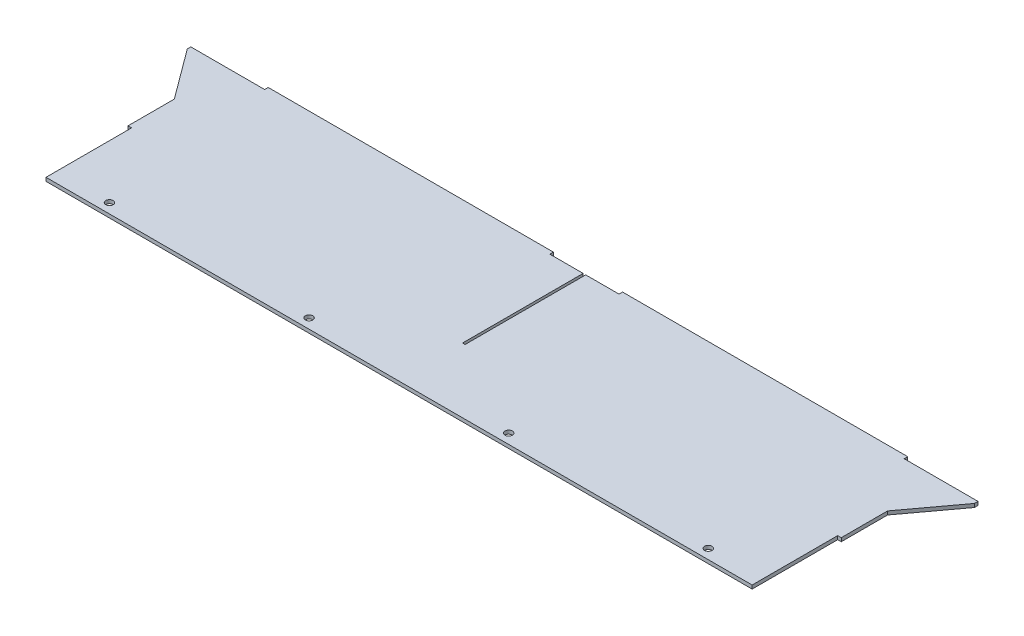
ISO-10303-21;
HEADER;
FILE_DESCRIPTION(('STEP AP214'),'2;1');
FILE_NAME('part.step','',(''),(''),'','','');
FILE_SCHEMA(('AUTOMOTIVE_DESIGN { 1 0 10303 214 1 1 1 1 }'));
ENDSEC;
DATA;
#1=APPLICATION_CONTEXT('core data for automotive mechanical design processes');
#2=APPLICATION_PROTOCOL_DEFINITION('international standard','automotive_design',2000,#1);
#3=PRODUCT_CONTEXT('',#1,'mechanical');
#4=PRODUCT('Part','Part','',(#3));
#5=PRODUCT_RELATED_PRODUCT_CATEGORY('part','',(#4));
#6=PRODUCT_DEFINITION_FORMATION('','',#4);
#7=PRODUCT_DEFINITION_CONTEXT('part definition',#1,'design');
#8=PRODUCT_DEFINITION('design','',#6,#7);
#9=PRODUCT_DEFINITION_SHAPE('','',#8);
#10=(LENGTH_UNIT() NAMED_UNIT(*) SI_UNIT(.MILLI.,.METRE.));
#11=(NAMED_UNIT(*) PLANE_ANGLE_UNIT() SI_UNIT($,.RADIAN.));
#12=(NAMED_UNIT(*) SI_UNIT($,.STERADIAN.) SOLID_ANGLE_UNIT());
#13=UNCERTAINTY_MEASURE_WITH_UNIT(LENGTH_MEASURE(1.E-05),#10,'distance_accuracy_value','');
#14=(GEOMETRIC_REPRESENTATION_CONTEXT(3) GLOBAL_UNCERTAINTY_ASSIGNED_CONTEXT((#13)) GLOBAL_UNIT_ASSIGNED_CONTEXT((#10,
#11,#12)) REPRESENTATION_CONTEXT('',''));
#15=CARTESIAN_POINT('',(0.,0.,0.));
#16=DIRECTION('',(0.,0.,1.));
#17=DIRECTION('',(1.,0.,0.));
#18=AXIS2_PLACEMENT_3D('',#15,#16,#17);
#19=CARTESIAN_POINT('',(-266.7,1.5875,73.8124000000001));
#20=DIRECTION('',(0.,1.,0.));
#21=DIRECTION('',(0.,0.,1.));
#22=AXIS2_PLACEMENT_3D('',#19,#20,#21);
#23=CYLINDRICAL_SURFACE('',#22,3.3);
#24=CARTESIAN_POINT('',(-266.7,-1.58750000000007,73.8124000000001));
#25=DIRECTION('',(0.,1.,0.));
#26=DIRECTION('',(0.,0.,1.));
#27=AXIS2_PLACEMENT_3D('',#24,#25,#26);
#28=CIRCLE('',#27,3.30000000000003);
#29=CARTESIAN_POINT('',(-266.7,-1.58750000000007,77.1124000000001));
#30=VERTEX_POINT('',#29);
#31=EDGE_CURVE('E46',#30,#30,#28,.T.);
#32=ORIENTED_EDGE('',*,*,#31,.F.);
#33=EDGE_LOOP('',(#32));
#34=FACE_BOUND('',#33,.T.);
#35=CARTESIAN_POINT('',(-266.7,1.5875,73.8124000000001));
#36=DIRECTION('',(0.,1.,0.));
#37=DIRECTION('',(0.,0.,1.));
#38=AXIS2_PLACEMENT_3D('',#35,#36,#37);
#39=CIRCLE('',#38,3.29999999999997);
#40=CARTESIAN_POINT('',(-266.7,1.5875,77.1124000000001));
#41=VERTEX_POINT('',#40);
#42=EDGE_CURVE('E11',#41,#41,#39,.T.);
#43=ORIENTED_EDGE('',*,*,#42,.T.);
#44=EDGE_LOOP('',(#43));
#45=FACE_BOUND('',#44,.T.);
#46=ADVANCED_FACE('F39',(#34,#45),#23,.F.);
#47=CARTESIAN_POINT('',(-88.8999999999999,1.5875,73.8124000000001));
#48=DIRECTION('',(0.,1.,0.));
#49=DIRECTION('',(0.,0.,1.));
#50=AXIS2_PLACEMENT_3D('',#47,#48,#49);
#51=CYLINDRICAL_SURFACE('',#50,3.3);
#52=CARTESIAN_POINT('',(-88.8999999999999,-1.58750000000007,73.8124000000001));
#53=DIRECTION('',(0.,1.,0.));
#54=DIRECTION('',(0.,0.,1.));
#55=AXIS2_PLACEMENT_3D('',#52,#53,#54);
#56=CIRCLE('',#55,3.30000000000003);
#57=CARTESIAN_POINT('',(-88.8999999999999,-1.58750000000007,77.1124000000001));
#58=VERTEX_POINT('',#57);
#59=EDGE_CURVE('E226',#58,#58,#56,.T.);
#60=ORIENTED_EDGE('',*,*,#59,.F.);
#61=EDGE_LOOP('',(#60));
#62=FACE_BOUND('',#61,.T.);
#63=CARTESIAN_POINT('',(-88.8999999999999,1.5875,73.8124000000001));
#64=DIRECTION('',(0.,1.,0.));
#65=DIRECTION('',(0.,0.,1.));
#66=AXIS2_PLACEMENT_3D('',#63,#64,#65);
#67=CIRCLE('',#66,3.29999999999997);
#68=CARTESIAN_POINT('',(-88.8999999999999,1.5875,77.1124000000001));
#69=VERTEX_POINT('',#68);
#70=EDGE_CURVE('E230',#69,#69,#67,.T.);
#71=ORIENTED_EDGE('',*,*,#70,.T.);
#72=EDGE_LOOP('',(#71));
#73=FACE_BOUND('',#72,.T.);
#74=ADVANCED_FACE('F258',(#62,#73),#51,.F.);
#75=CARTESIAN_POINT('',(317.6778,1.5875,-82.55));
#76=DIRECTION('',(-1.,0.,0.));
#77=DIRECTION('',(0.,0.,1.));
#78=AXIS2_PLACEMENT_3D('',#75,#76,#77);
#79=PLANE('',#78);
#80=DIRECTION('',(0.,-1.,0.));
#81=VECTOR('',#80,1.);
#82=CARTESIAN_POINT('',(317.6778,1.5875,6.35000000000007));
#83=LINE('',#82,#81);
#84=CARTESIAN_POINT('',(317.6778,1.5875,6.35000000000007));
#85=VERTEX_POINT('',#84);
#86=CARTESIAN_POINT('',(317.6778,-1.5875,6.35000000000007));
#87=VERTEX_POINT('',#86);
#88=EDGE_CURVE('E709',#85,#87,#83,.T.);
#89=ORIENTED_EDGE('',*,*,#88,.T.);
#90=DIRECTION('',(0.,0.,-1.));
#91=VECTOR('',#90,1.);
#92=CARTESIAN_POINT('',(317.6778,-1.5875,-82.55));
#93=LINE('',#92,#91);
#94=CARTESIAN_POINT('',(317.6778,-1.5875,-34.925));
#95=VERTEX_POINT('',#94);
#96=EDGE_CURVE('E236',#87,#95,#93,.T.);
#97=ORIENTED_EDGE('',*,*,#96,.T.);
#98=DIRECTION('',(0.,-1.,0.));
#99=VECTOR('',#98,1.);
#100=CARTESIAN_POINT('',(317.6778,1.5875,-34.925));
#101=LINE('',#100,#99);
#102=CARTESIAN_POINT('',(317.6778,1.5875,-34.925));
#103=VERTEX_POINT('',#102);
#104=EDGE_CURVE('E674',#103,#95,#101,.T.);
#105=ORIENTED_EDGE('',*,*,#104,.F.);
#106=DIRECTION('',(0.,0.,-1.));
#107=VECTOR('',#106,1.);
#108=CARTESIAN_POINT('',(317.6778,1.5875,-82.55));
#109=LINE('',#108,#107);
#110=EDGE_CURVE('E248',#85,#103,#109,.T.);
#111=ORIENTED_EDGE('',*,*,#110,.F.);
#112=EDGE_LOOP('',(#89,#97,#105,#111));
#113=FACE_BOUND('',#112,.T.);
#114=ADVANCED_FACE('F288',(#113),#79,.F.);
#115=CARTESIAN_POINT('',(-317.6778,1.5875,-82.55));
#116=DIRECTION('',(0.,0.,1.));
#117=DIRECTION('',(1.,0.,0.));
#118=AXIS2_PLACEMENT_3D('',#115,#116,#117);
#119=PLANE('',#118);
#120=DIRECTION('',(0.,-1.,0.));
#121=VECTOR('',#120,1.);
#122=CARTESIAN_POINT('',(-1.14299999999998,1.5875,-82.55));
#123=LINE('',#122,#121);
#124=CARTESIAN_POINT('',(-1.14299999999998,1.5875,-82.55));
#125=VERTEX_POINT('',#124);
#126=CARTESIAN_POINT('',(-1.14299999999998,-1.5875,-82.55));
#127=VERTEX_POINT('',#126);
#128=EDGE_CURVE('E642',#125,#127,#123,.T.);
#129=ORIENTED_EDGE('',*,*,#128,.T.);
#130=DIRECTION('',(-1.,0.,0.));
#131=VECTOR('',#130,1.);
#132=CARTESIAN_POINT('',(-317.6778,-1.5875,-82.55));
#133=LINE('',#132,#131);
#134=CARTESIAN_POINT('',(-30.8229000000015,-1.5875,-82.55));
#135=VERTEX_POINT('',#134);
#136=EDGE_CURVE('E244',#127,#135,#133,.T.);
#137=ORIENTED_EDGE('',*,*,#136,.T.);
#138=DIRECTION('',(0.,-1.,0.));
#139=VECTOR('',#138,1.);
#140=CARTESIAN_POINT('',(-30.8229000000015,-1.58750000000007,-82.55));
#141=LINE('',#140,#139);
#142=CARTESIAN_POINT('',(-30.8229000000015,1.5875,-82.55));
#143=VERTEX_POINT('',#142);
#144=EDGE_CURVE('E568',#143,#135,#141,.T.);
#145=ORIENTED_EDGE('',*,*,#144,.F.);
#146=DIRECTION('',(-1.,0.,0.));
#147=VECTOR('',#146,1.);
#148=CARTESIAN_POINT('',(-317.6778,1.5875,-82.55));
#149=LINE('',#148,#147);
#150=EDGE_CURVE('E584',#125,#143,#149,.T.);
#151=ORIENTED_EDGE('',*,*,#150,.F.);
#152=EDGE_LOOP('',(#129,#137,#145,#151));
#153=FACE_BOUND('',#152,.T.);
#154=ADVANCED_FACE('F271',(#153),#119,.F.);
#155=CARTESIAN_POINT('',(-317.6778,1.5875,82.55));
#156=DIRECTION('',(0.,0.,-1.));
#157=DIRECTION('',(-1.,0.,0.));
#158=AXIS2_PLACEMENT_3D('',#155,#156,#157);
#159=PLANE('',#158);
#160=DIRECTION('',(1.,0.,0.));
#161=VECTOR('',#160,1.);
#162=CARTESIAN_POINT('',(-317.6778,-1.5875,82.55));
#163=LINE('',#162,#161);
#164=CARTESIAN_POINT('',(-314.5028,-1.5875,82.55));
#165=VERTEX_POINT('',#164);
#166=CARTESIAN_POINT('',(314.5028,-1.5875,82.55));
#167=VERTEX_POINT('',#166);
#168=EDGE_CURVE('E247',#165,#167,#163,.T.);
#169=ORIENTED_EDGE('',*,*,#168,.T.);
#170=DIRECTION('',(0.,-1.,0.));
#171=VECTOR('',#170,1.);
#172=CARTESIAN_POINT('',(314.5028,1.5875,82.55));
#173=LINE('',#172,#171);
#174=CARTESIAN_POINT('',(314.5028,1.5875,82.55));
#175=VERTEX_POINT('',#174);
#176=EDGE_CURVE('E225',#175,#167,#173,.T.);
#177=ORIENTED_EDGE('',*,*,#176,.F.);
#178=DIRECTION('',(1.,0.,0.));
#179=VECTOR('',#178,1.);
#180=CARTESIAN_POINT('',(-317.6778,1.5875,82.55));
#181=LINE('',#180,#179);
#182=CARTESIAN_POINT('',(-314.5028,1.5875,82.55));
#183=VERTEX_POINT('',#182);
#184=EDGE_CURVE('E219',#183,#175,#181,.T.);
#185=ORIENTED_EDGE('',*,*,#184,.F.);
#186=DIRECTION('',(0.,-1.,0.));
#187=VECTOR('',#186,1.);
#188=CARTESIAN_POINT('',(-314.5028,1.5875,82.55));
#189=LINE('',#188,#187);
#190=EDGE_CURVE('E200',#183,#165,#189,.T.);
#191=ORIENTED_EDGE('',*,*,#190,.T.);
#192=EDGE_LOOP('',(#169,#177,#185,#191));
#193=FACE_BOUND('',#192,.T.);
#194=ADVANCED_FACE('F224',(#193),#159,.F.);
#195=CARTESIAN_POINT('',(0.,1.5875,0.));
#196=DIRECTION('',(0.,1.,0.));
#197=DIRECTION('',(0.,0.,1.));
#198=AXIS2_PLACEMENT_3D('',#195,#196,#197);
#199=PLANE('',#198);
#200=CARTESIAN_POINT('',(88.9000000000001,1.5875,73.8124000000001));
#201=DIRECTION('',(0.,1.,0.));
#202=DIRECTION('',(0.,0.,1.));
#203=AXIS2_PLACEMENT_3D('',#200,#201,#202);
#204=CIRCLE('',#203,3.29999999999997);
#205=CARTESIAN_POINT('',(88.9000000000001,1.5875,77.1124000000001));
#206=VERTEX_POINT('',#205);
#207=EDGE_CURVE('E742',#206,#206,#204,.T.);
#208=ORIENTED_EDGE('',*,*,#207,.F.);
#209=EDGE_LOOP('',(#208));
#210=FACE_BOUND('',#209,.T.);
#211=CARTESIAN_POINT('',(266.7,1.5875,73.8124000000001));
#212=DIRECTION('',(0.,1.,0.));
#213=DIRECTION('',(0.,0.,1.));
#214=AXIS2_PLACEMENT_3D('',#211,#212,#213);
#215=CIRCLE('',#214,3.29999999999997);
#216=CARTESIAN_POINT('',(266.7,1.5875,77.1124000000001));
#217=VERTEX_POINT('',#216);
#218=EDGE_CURVE('E739',#217,#217,#215,.T.);
#219=ORIENTED_EDGE('',*,*,#218,.F.);
#220=EDGE_LOOP('',(#219));
#221=FACE_BOUND('',#220,.T.);
#222=DIRECTION('',(0.,0.,-1.));
#223=VECTOR('',#222,1.);
#224=CARTESIAN_POINT('',(314.5028,1.5875,0.));
#225=LINE('',#224,#223);
#226=CARTESIAN_POINT('',(314.5028,1.5875,6.35000000000006));
#227=VERTEX_POINT('',#226);
#228=EDGE_CURVE('E714',#175,#227,#225,.T.);
#229=ORIENTED_EDGE('',*,*,#228,.T.);
#230=DIRECTION('',(-1.,0.,0.));
#231=VECTOR('',#230,1.);
#232=CARTESIAN_POINT('',(0.,1.5875,6.34999999999998));
#233=LINE('',#232,#231);
#234=EDGE_CURVE('E716',#85,#227,#233,.T.);
#235=ORIENTED_EDGE('',*,*,#234,.F.);
#236=ORIENTED_EDGE('',*,*,#110,.T.);
#237=DIRECTION('',(-0.594932036507486,0.,0.803776008560255));
#238=VECTOR('',#237,1.);
#239=CARTESIAN_POINT('',(350.57842,1.5875,-79.375));
#240=LINE('',#239,#238);
#241=CARTESIAN_POINT('',(350.57842,1.5875,-79.375));
#242=VERTEX_POINT('',#241);
#243=EDGE_CURVE('E665',#242,#103,#240,.T.);
#244=ORIENTED_EDGE('',*,*,#243,.F.);
#245=DIRECTION('',(0.,0.,1.));
#246=VECTOR('',#245,1.);
#247=CARTESIAN_POINT('',(350.57842,1.5875,-82.55));
#248=LINE('',#247,#246);
#249=CARTESIAN_POINT('',(350.57842,1.5875,-82.55));
#250=VERTEX_POINT('',#249);
#251=EDGE_CURVE('E662',#250,#242,#248,.T.);
#252=ORIENTED_EDGE('',*,*,#251,.F.);
#253=CARTESIAN_POINT('',(284.822900000001,1.5875,-82.55));
#254=VERTEX_POINT('',#253);
#255=EDGE_CURVE('E232',#250,#254,#149,.T.);
#256=ORIENTED_EDGE('',*,*,#255,.T.);
#257=DIRECTION('',(0.,0.,1.));
#258=VECTOR('',#257,1.);
#259=CARTESIAN_POINT('',(284.822900000001,1.58749999999994,-85.725));
#260=LINE('',#259,#258);
#261=CARTESIAN_POINT('',(284.822900000001,1.58749999999994,-85.725));
#262=VERTEX_POINT('',#261);
#263=EDGE_CURVE('E691',#262,#254,#260,.T.);
#264=ORIENTED_EDGE('',*,*,#263,.F.);
#265=DIRECTION('',(1.,0.,0.));
#266=VECTOR('',#265,1.);
#267=CARTESIAN_POINT('',(284.822900000001,1.58749999999994,-85.725));
#268=LINE('',#267,#266);
#269=CARTESIAN_POINT('',(30.8229000000015,1.58749999999994,-85.725));
#270=VERTEX_POINT('',#269);
#271=EDGE_CURVE('E689',#270,#262,#268,.T.);
#272=ORIENTED_EDGE('',*,*,#271,.F.);
#273=DIRECTION('',(0.,0.,1.));
#274=VECTOR('',#273,1.);
#275=CARTESIAN_POINT('',(30.8229000000015,1.58749999999994,-85.725));
#276=LINE('',#275,#274);
#277=CARTESIAN_POINT('',(30.8229000000014,1.5875,-82.55));
#278=VERTEX_POINT('',#277);
#279=EDGE_CURVE('E696',#270,#278,#276,.T.);
#280=ORIENTED_EDGE('',*,*,#279,.T.);
#281=CARTESIAN_POINT('',(1.14300000000002,1.5875,-82.55));
#282=VERTEX_POINT('',#281);
#283=EDGE_CURVE('E583',#278,#282,#149,.T.);
#284=ORIENTED_EDGE('',*,*,#283,.T.);
#285=DIRECTION('',(0.,0.,1.));
#286=VECTOR('',#285,1.);
#287=CARTESIAN_POINT('',(1.14300000000002,1.5875,0.));
#288=LINE('',#287,#286);
#289=CARTESIAN_POINT('',(1.14300000000002,1.5875,24.892));
#290=VERTEX_POINT('',#289);
#291=EDGE_CURVE('E646',#282,#290,#288,.T.);
#292=ORIENTED_EDGE('',*,*,#291,.T.);
#293=DIRECTION('',(1.,0.,0.));
#294=VECTOR('',#293,1.);
#295=CARTESIAN_POINT('',(0.,1.5875,24.892));
#296=LINE('',#295,#294);
#297=CARTESIAN_POINT('',(-1.14299999999998,1.5875,24.892));
#298=VERTEX_POINT('',#297);
#299=EDGE_CURVE('E631',#298,#290,#296,.T.);
#300=ORIENTED_EDGE('',*,*,#299,.F.);
#301=DIRECTION('',(0.,0.,1.));
#302=VECTOR('',#301,1.);
#303=CARTESIAN_POINT('',(-1.14299999999998,1.5875,0.));
#304=LINE('',#303,#302);
#305=EDGE_CURVE('E594',#125,#298,#304,.T.);
#306=ORIENTED_EDGE('',*,*,#305,.F.);
#307=ORIENTED_EDGE('',*,*,#150,.T.);
#308=DIRECTION('',(0.,0.,1.));
#309=VECTOR('',#308,1.);
#310=CARTESIAN_POINT('',(-30.8229000000015,1.58749999999994,-85.725));
#311=LINE('',#310,#309);
#312=CARTESIAN_POINT('',(-30.8229000000015,1.58749999999994,-85.725));
#313=VERTEX_POINT('',#312);
#314=EDGE_CURVE('E574',#313,#143,#311,.T.);
#315=ORIENTED_EDGE('',*,*,#314,.F.);
#316=DIRECTION('',(1.,0.,0.));
#317=VECTOR('',#316,1.);
#318=CARTESIAN_POINT('',(-30.8229000000015,1.58749999999994,-85.725));
#319=LINE('',#318,#317);
#320=CARTESIAN_POINT('',(-284.822900000001,1.58749999999994,-85.725));
#321=VERTEX_POINT('',#320);
#322=EDGE_CURVE('E573',#321,#313,#319,.T.);
#323=ORIENTED_EDGE('',*,*,#322,.F.);
#324=DIRECTION('',(0.,0.,1.));
#325=VECTOR('',#324,1.);
#326=CARTESIAN_POINT('',(-284.822900000001,1.58749999999994,-85.725));
#327=LINE('',#326,#325);
#328=CARTESIAN_POINT('',(-284.822900000001,1.58749999999994,-82.55));
#329=VERTEX_POINT('',#328);
#330=EDGE_CURVE('E562',#321,#329,#327,.T.);
#331=ORIENTED_EDGE('',*,*,#330,.T.);
#332=CARTESIAN_POINT('',(-350.57842,1.5875,-82.55));
#333=VERTEX_POINT('',#332);
#334=EDGE_CURVE('E570',#329,#333,#149,.T.);
#335=ORIENTED_EDGE('',*,*,#334,.T.);
#336=DIRECTION('',(0.,0.,1.));
#337=VECTOR('',#336,1.);
#338=CARTESIAN_POINT('',(-350.57842,1.5875,-82.55));
#339=LINE('',#338,#337);
#340=CARTESIAN_POINT('',(-350.57842,1.5875,-79.375));
#341=VERTEX_POINT('',#340);
#342=EDGE_CURVE('E649',#333,#341,#339,.T.);
#343=ORIENTED_EDGE('',*,*,#342,.T.);
#344=DIRECTION('',(0.594932036507486,0.,0.803776008560255));
#345=VECTOR('',#344,1.);
#346=CARTESIAN_POINT('',(-350.57842,1.5875,-79.375));
#347=LINE('',#346,#345);
#348=CARTESIAN_POINT('',(-317.6778,1.5875,-34.925));
#349=VERTEX_POINT('',#348);
#350=EDGE_CURVE('E647',#341,#349,#347,.T.);
#351=ORIENTED_EDGE('',*,*,#350,.T.);
#352=DIRECTION('',(0.,0.,1.));
#353=VECTOR('',#352,1.);
#354=CARTESIAN_POINT('',(-317.6778,1.5875,-82.55));
#355=LINE('',#354,#353);
#356=CARTESIAN_POINT('',(-317.6778,1.5875,6.34999999999999));
#357=VERTEX_POINT('',#356);
#358=EDGE_CURVE('E227',#349,#357,#355,.T.);
#359=ORIENTED_EDGE('',*,*,#358,.T.);
#360=DIRECTION('',(1.,0.,0.));
#361=VECTOR('',#360,1.);
#362=CARTESIAN_POINT('',(0.,1.5875,6.34999999999999));
#363=LINE('',#362,#361);
#364=CARTESIAN_POINT('',(-314.5028,1.5875,6.34999999999999));
#365=VERTEX_POINT('',#364);
#366=EDGE_CURVE('E211',#357,#365,#363,.T.);
#367=ORIENTED_EDGE('',*,*,#366,.T.);
#368=DIRECTION('',(0.,0.,-1.));
#369=VECTOR('',#368,1.);
#370=CARTESIAN_POINT('',(-314.5028,1.5875,0.));
#371=LINE('',#370,#369);
#372=EDGE_CURVE('E203',#183,#365,#371,.T.);
#373=ORIENTED_EDGE('',*,*,#372,.F.);
#374=ORIENTED_EDGE('',*,*,#184,.T.);
#375=EDGE_LOOP('',(#229,#235,#236,#244,#252,#256,#264,#272,#280,#284,#292,#300,#306,#307,#315,
#323,#331,#335,#343,#351,#359,#367,#373,#374));
#376=FACE_BOUND('',#375,.T.);
#377=ORIENTED_EDGE('',*,*,#70,.F.);
#378=EDGE_LOOP('',(#377));
#379=FACE_BOUND('',#378,.T.);
#380=ORIENTED_EDGE('',*,*,#42,.F.);
#381=EDGE_LOOP('',(#380));
#382=FACE_BOUND('',#381,.T.);
#383=ADVANCED_FACE('F217',(#210,#221,#376,#379,#382),#199,.T.);
#384=CARTESIAN_POINT('',(0.,-1.5875,0.));
#385=DIRECTION('',(0.,1.,0.));
#386=DIRECTION('',(0.,0.,1.));
#387=AXIS2_PLACEMENT_3D('',#384,#385,#386);
#388=PLANE('',#387);
#389=CARTESIAN_POINT('',(88.9000000000001,-1.58750000000007,73.8124000000001));
#390=DIRECTION('',(0.,1.,0.));
#391=DIRECTION('',(0.,0.,1.));
#392=AXIS2_PLACEMENT_3D('',#389,#390,#391);
#393=CIRCLE('',#392,3.30000000000003);
#394=CARTESIAN_POINT('',(88.9000000000001,-1.58750000000007,77.1124000000001));
#395=VERTEX_POINT('',#394);
#396=EDGE_CURVE('E745',#395,#395,#393,.T.);
#397=ORIENTED_EDGE('',*,*,#396,.T.);
#398=EDGE_LOOP('',(#397));
#399=FACE_BOUND('',#398,.T.);
#400=CARTESIAN_POINT('',(266.7,-1.58750000000007,73.8124000000001));
#401=DIRECTION('',(0.,1.,0.));
#402=DIRECTION('',(0.,0.,1.));
#403=AXIS2_PLACEMENT_3D('',#400,#401,#402);
#404=CIRCLE('',#403,3.30000000000003);
#405=CARTESIAN_POINT('',(266.7,-1.58750000000007,77.1124000000001));
#406=VERTEX_POINT('',#405);
#407=EDGE_CURVE('E718',#406,#406,#404,.T.);
#408=ORIENTED_EDGE('',*,*,#407,.T.);
#409=EDGE_LOOP('',(#408));
#410=FACE_BOUND('',#409,.T.);
#411=DIRECTION('',(-1.,0.,0.));
#412=VECTOR('',#411,1.);
#413=CARTESIAN_POINT('',(0.,-1.5875,6.34999999999998));
#414=LINE('',#413,#412);
#415=CARTESIAN_POINT('',(314.5028,-1.5875,6.35000000000006));
#416=VERTEX_POINT('',#415);
#417=EDGE_CURVE('E711',#87,#416,#414,.T.);
#418=ORIENTED_EDGE('',*,*,#417,.T.);
#419=DIRECTION('',(0.,0.,-1.));
#420=VECTOR('',#419,1.);
#421=CARTESIAN_POINT('',(314.5028,-1.5875,0.));
#422=LINE('',#421,#420);
#423=EDGE_CURVE('E713',#167,#416,#422,.T.);
#424=ORIENTED_EDGE('',*,*,#423,.F.);
#425=ORIENTED_EDGE('',*,*,#168,.F.);
#426=DIRECTION('',(0.,0.,-1.));
#427=VECTOR('',#426,1.);
#428=CARTESIAN_POINT('',(-314.5028,-1.5875,0.));
#429=LINE('',#428,#427);
#430=CARTESIAN_POINT('',(-314.5028,-1.5875,6.34999999999999));
#431=VERTEX_POINT('',#430);
#432=EDGE_CURVE('E206',#165,#431,#429,.T.);
#433=ORIENTED_EDGE('',*,*,#432,.T.);
#434=DIRECTION('',(1.,0.,0.));
#435=VECTOR('',#434,1.);
#436=CARTESIAN_POINT('',(0.,-1.5875,6.34999999999999));
#437=LINE('',#436,#435);
#438=CARTESIAN_POINT('',(-317.6778,-1.5875,6.34999999999998));
#439=VERTEX_POINT('',#438);
#440=EDGE_CURVE('E221',#439,#431,#437,.T.);
#441=ORIENTED_EDGE('',*,*,#440,.F.);
#442=DIRECTION('',(0.,0.,1.));
#443=VECTOR('',#442,1.);
#444=CARTESIAN_POINT('',(-317.6778,-1.5875,-82.55));
#445=LINE('',#444,#443);
#446=CARTESIAN_POINT('',(-317.6778,-1.5875,-34.925));
#447=VERTEX_POINT('',#446);
#448=EDGE_CURVE('E242',#447,#439,#445,.T.);
#449=ORIENTED_EDGE('',*,*,#448,.F.);
#450=DIRECTION('',(0.594932036507486,0.,0.803776008560255));
#451=VECTOR('',#450,1.);
#452=CARTESIAN_POINT('',(-350.57842,-1.5875,-79.375));
#453=LINE('',#452,#451);
#454=CARTESIAN_POINT('',(-350.57842,-1.5875,-79.375));
#455=VERTEX_POINT('',#454);
#456=EDGE_CURVE('E640',#455,#447,#453,.T.);
#457=ORIENTED_EDGE('',*,*,#456,.F.);
#458=DIRECTION('',(0.,0.,1.));
#459=VECTOR('',#458,1.);
#460=CARTESIAN_POINT('',(-350.57842,-1.5875,-82.55));
#461=LINE('',#460,#459);
#462=CARTESIAN_POINT('',(-350.57842,-1.5875,-82.55));
#463=VERTEX_POINT('',#462);
#464=EDGE_CURVE('E614',#463,#455,#461,.T.);
#465=ORIENTED_EDGE('',*,*,#464,.F.);
#466=CARTESIAN_POINT('',(-284.822900000001,-1.5875,-82.55));
#467=VERTEX_POINT('',#466);
#468=EDGE_CURVE('E238',#467,#463,#133,.T.);
#469=ORIENTED_EDGE('',*,*,#468,.F.);
#470=DIRECTION('',(0.,0.,1.));
#471=VECTOR('',#470,1.);
#472=CARTESIAN_POINT('',(-284.822900000001,-1.58750000000007,-85.725));
#473=LINE('',#472,#471);
#474=CARTESIAN_POINT('',(-284.822900000001,-1.58750000000007,-85.725));
#475=VERTEX_POINT('',#474);
#476=EDGE_CURVE('E565',#475,#467,#473,.T.);
#477=ORIENTED_EDGE('',*,*,#476,.F.);
#478=DIRECTION('',(-1.,0.,0.));
#479=VECTOR('',#478,1.);
#480=CARTESIAN_POINT('',(-30.8229000000015,-1.58750000000007,-85.725));
#481=LINE('',#480,#479);
#482=CARTESIAN_POINT('',(-30.8229000000015,-1.58750000000007,-85.725));
#483=VERTEX_POINT('',#482);
#484=EDGE_CURVE('E602',#483,#475,#481,.T.);
#485=ORIENTED_EDGE('',*,*,#484,.F.);
#486=DIRECTION('',(0.,0.,1.));
#487=VECTOR('',#486,1.);
#488=CARTESIAN_POINT('',(-30.8229000000015,-1.58750000000007,-85.725));
#489=LINE('',#488,#487);
#490=EDGE_CURVE('E239',#483,#135,#489,.T.);
#491=ORIENTED_EDGE('',*,*,#490,.T.);
#492=ORIENTED_EDGE('',*,*,#136,.F.);
#493=DIRECTION('',(0.,0.,1.));
#494=VECTOR('',#493,1.);
#495=CARTESIAN_POINT('',(-1.14299999999998,-1.5875,0.));
#496=LINE('',#495,#494);
#497=CARTESIAN_POINT('',(-1.14299999999998,-1.5875,24.892));
#498=VERTEX_POINT('',#497);
#499=EDGE_CURVE('E632',#127,#498,#496,.T.);
#500=ORIENTED_EDGE('',*,*,#499,.T.);
#501=DIRECTION('',(1.,0.,0.));
#502=VECTOR('',#501,1.);
#503=CARTESIAN_POINT('',(0.,-1.5875,24.892));
#504=LINE('',#503,#502);
#505=CARTESIAN_POINT('',(1.14300000000002,-1.5875,24.892));
#506=VERTEX_POINT('',#505);
#507=EDGE_CURVE('E53',#498,#506,#504,.T.);
#508=ORIENTED_EDGE('',*,*,#507,.T.);
#509=DIRECTION('',(0.,0.,1.));
#510=VECTOR('',#509,1.);
#511=CARTESIAN_POINT('',(1.14300000000002,-1.5875,0.));
#512=LINE('',#511,#510);
#513=CARTESIAN_POINT('',(1.14300000000002,-1.5875,-82.55));
#514=VERTEX_POINT('',#513);
#515=EDGE_CURVE('E628',#514,#506,#512,.T.);
#516=ORIENTED_EDGE('',*,*,#515,.F.);
#517=CARTESIAN_POINT('',(30.8229000000015,-1.58750000000007,-82.55));
#518=VERTEX_POINT('',#517);
#519=EDGE_CURVE('E243',#518,#514,#133,.T.);
#520=ORIENTED_EDGE('',*,*,#519,.F.);
#521=DIRECTION('',(0.,0.,1.));
#522=VECTOR('',#521,1.);
#523=CARTESIAN_POINT('',(30.8229000000015,-1.58750000000007,-85.725));
#524=LINE('',#523,#522);
#525=CARTESIAN_POINT('',(30.8229000000015,-1.58750000000007,-85.725));
#526=VERTEX_POINT('',#525);
#527=EDGE_CURVE('E625',#526,#518,#524,.T.);
#528=ORIENTED_EDGE('',*,*,#527,.F.);
#529=DIRECTION('',(-1.,0.,0.));
#530=VECTOR('',#529,1.);
#531=CARTESIAN_POINT('',(284.822900000001,-1.58750000000007,-85.725));
#532=LINE('',#531,#530);
#533=CARTESIAN_POINT('',(284.822900000001,-1.58750000000007,-85.725));
#534=VERTEX_POINT('',#533);
#535=EDGE_CURVE('E685',#534,#526,#532,.T.);
#536=ORIENTED_EDGE('',*,*,#535,.F.);
#537=DIRECTION('',(0.,0.,1.));
#538=VECTOR('',#537,1.);
#539=CARTESIAN_POINT('',(284.822900000001,-1.58750000000007,-85.725));
#540=LINE('',#539,#538);
#541=CARTESIAN_POINT('',(284.822900000001,-1.5875,-82.55));
#542=VERTEX_POINT('',#541);
#543=EDGE_CURVE('E599',#534,#542,#540,.T.);
#544=ORIENTED_EDGE('',*,*,#543,.T.);
#545=CARTESIAN_POINT('',(350.57842,-1.5875,-82.55));
#546=VERTEX_POINT('',#545);
#547=EDGE_CURVE('E240',#546,#542,#133,.T.);
#548=ORIENTED_EDGE('',*,*,#547,.F.);
#549=DIRECTION('',(0.,0.,1.));
#550=VECTOR('',#549,1.);
#551=CARTESIAN_POINT('',(350.57842,-1.5875,-82.55));
#552=LINE('',#551,#550);
#553=CARTESIAN_POINT('',(350.57842,-1.5875,-79.375));
#554=VERTEX_POINT('',#553);
#555=EDGE_CURVE('E656',#546,#554,#552,.T.);
#556=ORIENTED_EDGE('',*,*,#555,.T.);
#557=DIRECTION('',(-0.594932036507486,0.,0.803776008560255));
#558=VECTOR('',#557,1.);
#559=CARTESIAN_POINT('',(350.57842,-1.5875,-79.375));
#560=LINE('',#559,#558);
#561=EDGE_CURVE('E666',#554,#95,#560,.T.);
#562=ORIENTED_EDGE('',*,*,#561,.T.);
#563=ORIENTED_EDGE('',*,*,#96,.F.);
#564=EDGE_LOOP('',(#418,#424,#425,#433,#441,#449,#457,#465,#469,#477,#485,#491,#492,#500,#508,
#516,#520,#528,#536,#544,#548,#556,#562,#563));
#565=FACE_BOUND('',#564,.T.);
#566=ORIENTED_EDGE('',*,*,#59,.T.);
#567=EDGE_LOOP('',(#566));
#568=FACE_BOUND('',#567,.T.);
#569=ORIENTED_EDGE('',*,*,#31,.T.);
#570=EDGE_LOOP('',(#569));
#571=FACE_BOUND('',#570,.T.);
#572=ADVANCED_FACE('F254',(#399,#410,#565,#568,#571),#388,.F.);
#573=DIRECTION('',(0.,-1.,0.));
#574=VECTOR('',#573,1.);
#575=CARTESIAN_POINT('',(284.822900000001,-1.58750000000007,-82.55));
#576=LINE('',#575,#574);
#577=EDGE_CURVE('E677',#254,#542,#576,.T.);
#578=ORIENTED_EDGE('',*,*,#577,.F.);
#579=ORIENTED_EDGE('',*,*,#255,.F.);
#580=DIRECTION('',(0.,-1.,0.));
#581=VECTOR('',#580,1.);
#582=CARTESIAN_POINT('',(350.57842,1.5875,-82.55));
#583=LINE('',#582,#581);
#584=EDGE_CURVE('E669',#250,#546,#583,.T.);
#585=ORIENTED_EDGE('',*,*,#584,.T.);
#586=ORIENTED_EDGE('',*,*,#547,.T.);
#587=EDGE_LOOP('',(#578,#579,#585,#586));
#588=FACE_BOUND('',#587,.T.);
#589=ADVANCED_FACE('F268',(#588),#119,.F.);
#590=ORIENTED_EDGE('',*,*,#519,.T.);
#591=DIRECTION('',(0.,-1.,0.));
#592=VECTOR('',#591,1.);
#593=CARTESIAN_POINT('',(1.14300000000002,1.5875,-82.55));
#594=LINE('',#593,#592);
#595=EDGE_CURVE('E619',#282,#514,#594,.T.);
#596=ORIENTED_EDGE('',*,*,#595,.F.);
#597=ORIENTED_EDGE('',*,*,#283,.F.);
#598=DIRECTION('',(0.,1.,0.));
#599=VECTOR('',#598,1.);
#600=CARTESIAN_POINT('',(30.8229000000015,1.58749999999994,-82.55));
#601=LINE('',#600,#599);
#602=EDGE_CURVE('E621',#518,#278,#601,.T.);
#603=ORIENTED_EDGE('',*,*,#602,.F.);
#604=EDGE_LOOP('',(#590,#596,#597,#603));
#605=FACE_BOUND('',#604,.T.);
#606=ADVANCED_FACE('F286',(#605),#119,.F.);
#607=DIRECTION('',(0.,1.,0.));
#608=VECTOR('',#607,1.);
#609=CARTESIAN_POINT('',(-284.822900000001,1.58749999999994,-82.55));
#610=LINE('',#609,#608);
#611=EDGE_CURVE('E559',#467,#329,#610,.T.);
#612=ORIENTED_EDGE('',*,*,#611,.F.);
#613=ORIENTED_EDGE('',*,*,#468,.T.);
#614=DIRECTION('',(0.,-1.,0.));
#615=VECTOR('',#614,1.);
#616=CARTESIAN_POINT('',(-350.57842,1.5875,-82.55));
#617=LINE('',#616,#615);
#618=EDGE_CURVE('E654',#333,#463,#617,.T.);
#619=ORIENTED_EDGE('',*,*,#618,.F.);
#620=ORIENTED_EDGE('',*,*,#334,.F.);
#621=EDGE_LOOP('',(#612,#613,#619,#620));
#622=FACE_BOUND('',#621,.T.);
#623=ADVANCED_FACE('F282',(#622),#119,.F.);
#624=CARTESIAN_POINT('',(-317.6778,1.5875,-82.55));
#625=DIRECTION('',(1.,0.,0.));
#626=DIRECTION('',(0.,0.,-1.));
#627=AXIS2_PLACEMENT_3D('',#624,#625,#626);
#628=PLANE('',#627);
#629=ORIENTED_EDGE('',*,*,#448,.T.);
#630=DIRECTION('',(0.,-1.,0.));
#631=VECTOR('',#630,1.);
#632=CARTESIAN_POINT('',(-317.6778,1.5875,6.34999999999999));
#633=LINE('',#632,#631);
#634=EDGE_CURVE('E61',#357,#439,#633,.T.);
#635=ORIENTED_EDGE('',*,*,#634,.F.);
#636=ORIENTED_EDGE('',*,*,#358,.F.);
#637=DIRECTION('',(0.,-1.,0.));
#638=VECTOR('',#637,1.);
#639=CARTESIAN_POINT('',(-317.6778,1.5875,-34.925));
#640=LINE('',#639,#638);
#641=EDGE_CURVE('E651',#349,#447,#640,.T.);
#642=ORIENTED_EDGE('',*,*,#641,.T.);
#643=EDGE_LOOP('',(#629,#635,#636,#642));
#644=FACE_BOUND('',#643,.T.);
#645=ADVANCED_FACE('F279',(#644),#628,.F.);
#646=CARTESIAN_POINT('',(-30.8229000000015,-1.58750000000007,-85.725));
#647=DIRECTION('',(-1.,0.,0.));
#648=DIRECTION('',(0.,0.,1.));
#649=AXIS2_PLACEMENT_3D('',#646,#647,#648);
#650=PLANE('',#649);
#651=ORIENTED_EDGE('',*,*,#144,.T.);
#652=ORIENTED_EDGE('',*,*,#490,.F.);
#653=DIRECTION('',(0.,-1.,0.));
#654=VECTOR('',#653,1.);
#655=CARTESIAN_POINT('',(-30.8229000000015,-1.58750000000007,-85.725));
#656=LINE('',#655,#654);
#657=EDGE_CURVE('E567',#313,#483,#656,.T.);
#658=ORIENTED_EDGE('',*,*,#657,.F.);
#659=ORIENTED_EDGE('',*,*,#314,.T.);
#660=EDGE_LOOP('',(#651,#652,#658,#659));
#661=FACE_BOUND('',#660,.T.);
#662=ADVANCED_FACE('F276',(#661),#650,.F.);
#663=CARTESIAN_POINT('',(-284.822900000001,1.58749999999994,-85.725));
#664=DIRECTION('',(1.,0.,0.));
#665=DIRECTION('',(0.,1.,0.));
#666=AXIS2_PLACEMENT_3D('',#663,#664,#665);
#667=PLANE('',#666);
#668=ORIENTED_EDGE('',*,*,#611,.T.);
#669=ORIENTED_EDGE('',*,*,#330,.F.);
#670=DIRECTION('',(0.,1.,0.));
#671=VECTOR('',#670,1.);
#672=CARTESIAN_POINT('',(-284.822900000001,1.58749999999994,-85.725));
#673=LINE('',#672,#671);
#674=EDGE_CURVE('E604',#475,#321,#673,.T.);
#675=ORIENTED_EDGE('',*,*,#674,.F.);
#676=ORIENTED_EDGE('',*,*,#476,.T.);
#677=EDGE_LOOP('',(#668,#669,#675,#676));
#678=FACE_BOUND('',#677,.T.);
#679=ADVANCED_FACE('F549',(#678),#667,.F.);
#680=CARTESIAN_POINT('',(0.,0.,-85.725));
#681=DIRECTION('',(0.,0.,1.));
#682=DIRECTION('',(1.,0.,0.));
#683=AXIS2_PLACEMENT_3D('',#680,#681,#682);
#684=PLANE('',#683);
#685=ORIENTED_EDGE('',*,*,#657,.T.);
#686=ORIENTED_EDGE('',*,*,#484,.T.);
#687=ORIENTED_EDGE('',*,*,#674,.T.);
#688=ORIENTED_EDGE('',*,*,#322,.T.);
#689=EDGE_LOOP('',(#685,#686,#687,#688));
#690=FACE_BOUND('',#689,.T.);
#691=ADVANCED_FACE('F546',(#690),#684,.F.);
#692=CARTESIAN_POINT('',(284.822900000001,-1.58750000000007,-85.725));
#693=DIRECTION('',(-1.,0.,0.));
#694=DIRECTION('',(0.,-1.,0.));
#695=AXIS2_PLACEMENT_3D('',#692,#693,#694);
#696=PLANE('',#695);
#697=ORIENTED_EDGE('',*,*,#577,.T.);
#698=ORIENTED_EDGE('',*,*,#543,.F.);
#699=DIRECTION('',(0.,-1.,0.));
#700=VECTOR('',#699,1.);
#701=CARTESIAN_POINT('',(284.822900000001,-1.58750000000007,-85.725));
#702=LINE('',#701,#700);
#703=EDGE_CURVE('E682',#262,#534,#702,.T.);
#704=ORIENTED_EDGE('',*,*,#703,.F.);
#705=ORIENTED_EDGE('',*,*,#263,.T.);
#706=EDGE_LOOP('',(#697,#698,#704,#705));
#707=FACE_BOUND('',#706,.T.);
#708=ADVANCED_FACE('F542',(#707),#696,.F.);
#709=CARTESIAN_POINT('',(30.8229000000015,1.58749999999994,-85.725));
#710=DIRECTION('',(1.,0.,0.));
#711=DIRECTION('',(0.,0.,-1.));
#712=AXIS2_PLACEMENT_3D('',#709,#710,#711);
#713=PLANE('',#712);
#714=ORIENTED_EDGE('',*,*,#602,.T.);
#715=ORIENTED_EDGE('',*,*,#279,.F.);
#716=DIRECTION('',(0.,1.,0.));
#717=VECTOR('',#716,1.);
#718=CARTESIAN_POINT('',(30.8229000000015,1.58749999999994,-85.725));
#719=LINE('',#718,#717);
#720=EDGE_CURVE('E687',#526,#270,#719,.T.);
#721=ORIENTED_EDGE('',*,*,#720,.F.);
#722=ORIENTED_EDGE('',*,*,#527,.T.);
#723=EDGE_LOOP('',(#714,#715,#721,#722));
#724=FACE_BOUND('',#723,.T.);
#725=ADVANCED_FACE('F538',(#724),#713,.F.);
#726=CARTESIAN_POINT('',(0.,0.,-85.725));
#727=DIRECTION('',(0.,0.,1.));
#728=DIRECTION('',(1.,0.,0.));
#729=AXIS2_PLACEMENT_3D('',#726,#727,#728);
#730=PLANE('',#729);
#731=ORIENTED_EDGE('',*,*,#703,.T.);
#732=ORIENTED_EDGE('',*,*,#535,.T.);
#733=ORIENTED_EDGE('',*,*,#720,.T.);
#734=ORIENTED_EDGE('',*,*,#271,.T.);
#735=EDGE_LOOP('',(#731,#732,#733,#734));
#736=FACE_BOUND('',#735,.T.);
#737=ADVANCED_FACE('F479',(#736),#730,.F.);
#738=CARTESIAN_POINT('',(350.57842,1.5875,-79.375));
#739=DIRECTION('',(0.803776008560255,0.,0.594932036507486));
#740=DIRECTION('',(0.594932036507486,0.,-0.803776008560255));
#741=AXIS2_PLACEMENT_3D('',#738,#739,#740);
#742=PLANE('',#741);
#743=ORIENTED_EDGE('',*,*,#561,.F.);
#744=DIRECTION('',(0.,-1.,0.));
#745=VECTOR('',#744,1.);
#746=CARTESIAN_POINT('',(350.57842,1.5875,-79.375));
#747=LINE('',#746,#745);
#748=EDGE_CURVE('E678',#242,#554,#747,.T.);
#749=ORIENTED_EDGE('',*,*,#748,.F.);
#750=ORIENTED_EDGE('',*,*,#243,.T.);
#751=ORIENTED_EDGE('',*,*,#104,.T.);
#752=EDGE_LOOP('',(#743,#749,#750,#751));
#753=FACE_BOUND('',#752,.T.);
#754=ADVANCED_FACE('F483',(#753),#742,.T.);
#755=CARTESIAN_POINT('',(350.57842,1.5875,-82.55));
#756=DIRECTION('',(1.,0.,0.));
#757=DIRECTION('',(0.,0.,-1.));
#758=AXIS2_PLACEMENT_3D('',#755,#756,#757);
#759=PLANE('',#758);
#760=ORIENTED_EDGE('',*,*,#555,.F.);
#761=ORIENTED_EDGE('',*,*,#584,.F.);
#762=ORIENTED_EDGE('',*,*,#251,.T.);
#763=ORIENTED_EDGE('',*,*,#748,.T.);
#764=EDGE_LOOP('',(#760,#761,#762,#763));
#765=FACE_BOUND('',#764,.T.);
#766=ADVANCED_FACE('F487',(#765),#759,.T.);
#767=CARTESIAN_POINT('',(-350.57842,1.5875,-82.55));
#768=DIRECTION('',(1.,0.,0.));
#769=DIRECTION('',(0.,0.,-1.));
#770=AXIS2_PLACEMENT_3D('',#767,#768,#769);
#771=PLANE('',#770);
#772=ORIENTED_EDGE('',*,*,#464,.T.);
#773=DIRECTION('',(0.,-1.,0.));
#774=VECTOR('',#773,1.);
#775=CARTESIAN_POINT('',(-350.57842,1.5875,-79.375));
#776=LINE('',#775,#774);
#777=EDGE_CURVE('E657',#341,#455,#776,.T.);
#778=ORIENTED_EDGE('',*,*,#777,.F.);
#779=ORIENTED_EDGE('',*,*,#342,.F.);
#780=ORIENTED_EDGE('',*,*,#618,.T.);
#781=EDGE_LOOP('',(#772,#778,#779,#780));
#782=FACE_BOUND('',#781,.T.);
#783=ADVANCED_FACE('F497',(#782),#771,.F.);
#784=CARTESIAN_POINT('',(-350.57842,1.5875,-79.375));
#785=DIRECTION('',(0.803776008560255,0.,-0.594932036507486));
#786=DIRECTION('',(-0.594932036507486,0.,-0.803776008560255));
#787=AXIS2_PLACEMENT_3D('',#784,#785,#786);
#788=PLANE('',#787);
#789=ORIENTED_EDGE('',*,*,#456,.T.);
#790=ORIENTED_EDGE('',*,*,#641,.F.);
#791=ORIENTED_EDGE('',*,*,#350,.F.);
#792=ORIENTED_EDGE('',*,*,#777,.T.);
#793=EDGE_LOOP('',(#789,#790,#791,#792));
#794=FACE_BOUND('',#793,.T.);
#795=ADVANCED_FACE('F346',(#794),#788,.F.);
#796=CARTESIAN_POINT('',(0.,1.5875,24.892));
#797=DIRECTION('',(0.,0.,-1.));
#798=DIRECTION('',(-1.,0.,0.));
#799=AXIS2_PLACEMENT_3D('',#796,#797,#798);
#800=PLANE('',#799);
#801=ORIENTED_EDGE('',*,*,#507,.F.);
#802=DIRECTION('',(0.,-1.,0.));
#803=VECTOR('',#802,1.);
#804=CARTESIAN_POINT('',(-1.14299999999998,1.5875,24.892));
#805=LINE('',#804,#803);
#806=EDGE_CURVE('E644',#298,#498,#805,.T.);
#807=ORIENTED_EDGE('',*,*,#806,.F.);
#808=ORIENTED_EDGE('',*,*,#299,.T.);
#809=DIRECTION('',(0.,-1.,0.));
#810=VECTOR('',#809,1.);
#811=CARTESIAN_POINT('',(1.14300000000002,1.5875,24.892));
#812=LINE('',#811,#810);
#813=EDGE_CURVE('E638',#290,#506,#812,.T.);
#814=ORIENTED_EDGE('',*,*,#813,.T.);
#815=EDGE_LOOP('',(#801,#807,#808,#814));
#816=FACE_BOUND('',#815,.T.);
#817=ADVANCED_FACE('F340',(#816),#800,.T.);
#818=CARTESIAN_POINT('',(1.14300000000002,1.5875,0.));
#819=DIRECTION('',(1.,0.,0.));
#820=DIRECTION('',(0.,0.,-1.));
#821=AXIS2_PLACEMENT_3D('',#818,#819,#820);
#822=PLANE('',#821);
#823=ORIENTED_EDGE('',*,*,#515,.T.);
#824=ORIENTED_EDGE('',*,*,#813,.F.);
#825=ORIENTED_EDGE('',*,*,#291,.F.);
#826=ORIENTED_EDGE('',*,*,#595,.T.);
#827=EDGE_LOOP('',(#823,#824,#825,#826));
#828=FACE_BOUND('',#827,.T.);
#829=ADVANCED_FACE('F345',(#828),#822,.F.);
#830=CARTESIAN_POINT('',(-1.14299999999998,1.5875,0.));
#831=DIRECTION('',(1.,0.,0.));
#832=DIRECTION('',(0.,0.,-1.));
#833=AXIS2_PLACEMENT_3D('',#830,#831,#832);
#834=PLANE('',#833);
#835=ORIENTED_EDGE('',*,*,#499,.F.);
#836=ORIENTED_EDGE('',*,*,#128,.F.);
#837=ORIENTED_EDGE('',*,*,#305,.T.);
#838=ORIENTED_EDGE('',*,*,#806,.T.);
#839=EDGE_LOOP('',(#835,#836,#837,#838));
#840=FACE_BOUND('',#839,.T.);
#841=ADVANCED_FACE('F357',(#840),#834,.T.);
#842=CARTESIAN_POINT('',(-314.5028,1.5875,0.));
#843=DIRECTION('',(-1.,0.,0.));
#844=DIRECTION('',(0.,0.,1.));
#845=AXIS2_PLACEMENT_3D('',#842,#843,#844);
#846=PLANE('',#845);
#847=ORIENTED_EDGE('',*,*,#432,.F.);
#848=ORIENTED_EDGE('',*,*,#190,.F.);
#849=ORIENTED_EDGE('',*,*,#372,.T.);
#850=DIRECTION('',(0.,-1.,0.));
#851=VECTOR('',#850,1.);
#852=CARTESIAN_POINT('',(-314.5028,1.5875,6.34999999999999));
#853=LINE('',#852,#851);
#854=EDGE_CURVE('E728',#365,#431,#853,.T.);
#855=ORIENTED_EDGE('',*,*,#854,.T.);
#856=EDGE_LOOP('',(#847,#848,#849,#855));
#857=FACE_BOUND('',#856,.T.);
#858=ADVANCED_FACE('F202',(#857),#846,.T.);
#859=CARTESIAN_POINT('',(0.,1.5875,6.34999999999999));
#860=DIRECTION('',(0.,0.,-1.));
#861=DIRECTION('',(-1.,0.,0.));
#862=AXIS2_PLACEMENT_3D('',#859,#860,#861);
#863=PLANE('',#862);
#864=ORIENTED_EDGE('',*,*,#440,.T.);
#865=ORIENTED_EDGE('',*,*,#854,.F.);
#866=ORIENTED_EDGE('',*,*,#366,.F.);
#867=ORIENTED_EDGE('',*,*,#634,.T.);
#868=EDGE_LOOP('',(#864,#865,#866,#867));
#869=FACE_BOUND('',#868,.T.);
#870=ADVANCED_FACE('F378',(#869),#863,.F.);
#871=CARTESIAN_POINT('',(0.,1.5875,6.34999999999998));
#872=DIRECTION('',(0.,0.,1.));
#873=DIRECTION('',(1.,0.,0.));
#874=AXIS2_PLACEMENT_3D('',#871,#872,#873);
#875=PLANE('',#874);
#876=ORIENTED_EDGE('',*,*,#417,.F.);
#877=ORIENTED_EDGE('',*,*,#88,.F.);
#878=ORIENTED_EDGE('',*,*,#234,.T.);
#879=DIRECTION('',(0.,-1.,0.));
#880=VECTOR('',#879,1.);
#881=CARTESIAN_POINT('',(314.5028,1.5875,6.35000000000006));
#882=LINE('',#881,#880);
#883=EDGE_CURVE('E723',#227,#416,#882,.T.);
#884=ORIENTED_EDGE('',*,*,#883,.T.);
#885=EDGE_LOOP('',(#876,#877,#878,#884));
#886=FACE_BOUND('',#885,.T.);
#887=ADVANCED_FACE('F388',(#886),#875,.T.);
#888=CARTESIAN_POINT('',(314.5028,1.5875,0.));
#889=DIRECTION('',(-1.,0.,0.));
#890=DIRECTION('',(0.,0.,1.));
#891=AXIS2_PLACEMENT_3D('',#888,#889,#890);
#892=PLANE('',#891);
#893=ORIENTED_EDGE('',*,*,#423,.T.);
#894=ORIENTED_EDGE('',*,*,#883,.F.);
#895=ORIENTED_EDGE('',*,*,#228,.F.);
#896=ORIENTED_EDGE('',*,*,#176,.T.);
#897=EDGE_LOOP('',(#893,#894,#895,#896));
#898=FACE_BOUND('',#897,.T.);
#899=ADVANCED_FACE('F398',(#898),#892,.F.);
#900=CARTESIAN_POINT('',(266.7,1.5875,73.8124000000001));
#901=DIRECTION('',(0.,1.,0.));
#902=DIRECTION('',(0.,0.,1.));
#903=AXIS2_PLACEMENT_3D('',#900,#901,#902);
#904=CYLINDRICAL_SURFACE('',#903,3.3);
#905=ORIENTED_EDGE('',*,*,#407,.F.);
#906=EDGE_LOOP('',(#905));
#907=FACE_BOUND('',#906,.T.);
#908=ORIENTED_EDGE('',*,*,#218,.T.);
#909=EDGE_LOOP('',(#908));
#910=FACE_BOUND('',#909,.T.);
#911=ADVANCED_FACE('F409',(#907,#910),#904,.F.);
#912=CARTESIAN_POINT('',(88.9000000000001,1.5875,73.8124000000001));
#913=DIRECTION('',(0.,1.,0.));
#914=DIRECTION('',(0.,0.,1.));
#915=AXIS2_PLACEMENT_3D('',#912,#913,#914);
#916=CYLINDRICAL_SURFACE('',#915,3.3);
#917=ORIENTED_EDGE('',*,*,#396,.F.);
#918=EDGE_LOOP('',(#917));
#919=FACE_BOUND('',#918,.T.);
#920=ORIENTED_EDGE('',*,*,#207,.T.);
#921=EDGE_LOOP('',(#920));
#922=FACE_BOUND('',#921,.T.);
#923=ADVANCED_FACE('F419',(#919,#922),#916,.F.);
#924=CLOSED_SHELL('',(#46,#74,#114,#154,#194,#383,#572,#589,#606,#623,#645,#662,#679,#691,#708,
#725,#737,#754,#766,#783,#795,#817,#829,#841,#858,#870,#887,#899,#911,#923));
#925=MANIFOLD_SOLID_BREP('B2',#924);
#926=ADVANCED_BREP_SHAPE_REPRESENTATION('',(#18,#925),#14);
#927=SHAPE_DEFINITION_REPRESENTATION(#9,#926);
ENDSEC;
END-ISO-10303-21;
